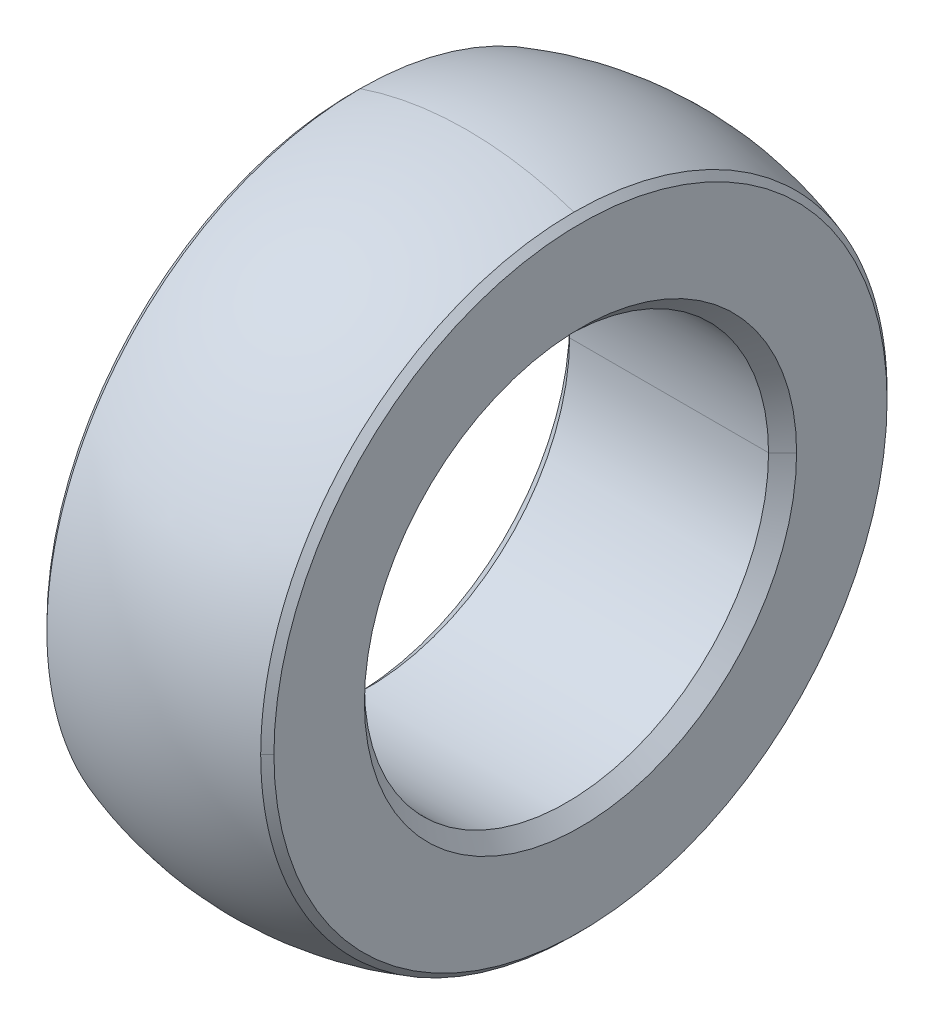
ISO-10303-21;
HEADER;
FILE_DESCRIPTION(('STEP AP214'),'2;1');
FILE_NAME('part.step','',(''),(''),'','','');
FILE_SCHEMA(('AUTOMOTIVE_DESIGN { 1 0 10303 214 1 1 1 1 }'));
ENDSEC;
DATA;
#1=APPLICATION_CONTEXT('core data for automotive mechanical design processes');
#2=APPLICATION_PROTOCOL_DEFINITION('international standard','automotive_design',2000,#1);
#3=PRODUCT_CONTEXT('',#1,'mechanical');
#4=PRODUCT('Part','Part','',(#3));
#5=PRODUCT_RELATED_PRODUCT_CATEGORY('part','',(#4));
#6=PRODUCT_DEFINITION_FORMATION('','',#4);
#7=PRODUCT_DEFINITION_CONTEXT('part definition',#1,'design');
#8=PRODUCT_DEFINITION('design','',#6,#7);
#9=PRODUCT_DEFINITION_SHAPE('','',#8);
#10=(LENGTH_UNIT() NAMED_UNIT(*) SI_UNIT(.MILLI.,.METRE.));
#11=(NAMED_UNIT(*) PLANE_ANGLE_UNIT() SI_UNIT($,.RADIAN.));
#12=(NAMED_UNIT(*) SI_UNIT($,.STERADIAN.) SOLID_ANGLE_UNIT());
#13=UNCERTAINTY_MEASURE_WITH_UNIT(LENGTH_MEASURE(1.E-05),#10,'distance_accuracy_value','');
#14=(GEOMETRIC_REPRESENTATION_CONTEXT(3) GLOBAL_UNCERTAINTY_ASSIGNED_CONTEXT((#13)) GLOBAL_UNIT_ASSIGNED_CONTEXT((#10,
#11,#12)) REPRESENTATION_CONTEXT('',''));
#15=CARTESIAN_POINT('',(0.,0.,0.));
#16=DIRECTION('',(0.,0.,1.));
#17=DIRECTION('',(1.,0.,0.));
#18=AXIS2_PLACEMENT_3D('',#15,#16,#17);
#19=CARTESIAN_POINT('',(0.,0.,0.));
#20=DIRECTION('',(-1.,0.,0.));
#21=DIRECTION('',(0.,0.,1.));
#22=AXIS2_PLACEMENT_3D('',#19,#20,#21);
#23=CONICAL_SURFACE('',#22,8.3185,0.78539816339745);
#24=DIRECTION('',(-0.707106781186546,0.,-0.707106781186549));
#25=VECTOR('',#24,1.);
#26=CARTESIAN_POINT('',(0.,0.,-8.3185));
#27=LINE('',#26,#25);
#28=CARTESIAN_POINT('',(0.53975,0.,-7.77875));
#29=VERTEX_POINT('',#28);
#30=CARTESIAN_POINT('',(0.,0.,-8.3185));
#31=VERTEX_POINT('',#30);
#32=EDGE_CURVE('E129',#29,#31,#27,.T.);
#33=ORIENTED_EDGE('',*,*,#32,.F.);
#34=CARTESIAN_POINT('',(0.53975,0.,0.));
#35=DIRECTION('',(-1.,0.,0.));
#36=DIRECTION('',(0.,0.,1.));
#37=AXIS2_PLACEMENT_3D('',#34,#35,#36);
#38=CIRCLE('',#37,7.77875);
#39=CARTESIAN_POINT('',(0.53975,0.,7.77875));
#40=VERTEX_POINT('',#39);
#41=EDGE_CURVE('E11',#40,#29,#38,.T.);
#42=ORIENTED_EDGE('',*,*,#41,.F.);
#43=DIRECTION('',(-0.707106781186546,0.,0.707106781186549));
#44=VECTOR('',#43,1.);
#45=CARTESIAN_POINT('',(0.,0.,8.3185));
#46=LINE('',#45,#44);
#47=CARTESIAN_POINT('',(0.,0.,8.3185));
#48=VERTEX_POINT('',#47);
#49=EDGE_CURVE('E139',#40,#48,#46,.T.);
#50=ORIENTED_EDGE('',*,*,#49,.T.);
#51=CARTESIAN_POINT('',(0.,0.,0.));
#52=DIRECTION('',(-1.,0.,0.));
#53=DIRECTION('',(0.,0.,1.));
#54=AXIS2_PLACEMENT_3D('',#51,#52,#53);
#55=CIRCLE('',#54,8.3185);
#56=EDGE_CURVE('E131',#48,#31,#55,.T.);
#57=ORIENTED_EDGE('',*,*,#56,.T.);
#58=EDGE_LOOP('',(#33,#42,#50,#57));
#59=FACE_BOUND('',#58,.T.);
#60=ADVANCED_FACE('F17',(#59),#23,.F.);
#61=CARTESIAN_POINT('',(0.,0.,0.));
#62=DIRECTION('',(-1.,0.,0.));
#63=DIRECTION('',(0.,0.,1.));
#64=AXIS2_PLACEMENT_3D('',#61,#62,#63);
#65=CYLINDRICAL_SURFACE('',#64,7.77875);
#66=DIRECTION('',(-1.,0.,0.));
#67=VECTOR('',#66,1.);
#68=CARTESIAN_POINT('',(0.,0.,-7.77875));
#69=LINE('',#68,#67);
#70=CARTESIAN_POINT('',(8.19785,0.,-7.77875));
#71=VERTEX_POINT('',#70);
#72=EDGE_CURVE('E114',#71,#29,#69,.T.);
#73=ORIENTED_EDGE('',*,*,#72,.F.);
#74=CARTESIAN_POINT('',(8.19785,0.,0.));
#75=DIRECTION('',(-1.,0.,0.));
#76=DIRECTION('',(0.,0.,1.));
#77=AXIS2_PLACEMENT_3D('',#74,#75,#76);
#78=CIRCLE('',#77,7.77875);
#79=CARTESIAN_POINT('',(8.19785,0.,7.77875));
#80=VERTEX_POINT('',#79);
#81=EDGE_CURVE('E28',#80,#71,#78,.T.);
#82=ORIENTED_EDGE('',*,*,#81,.F.);
#83=DIRECTION('',(-1.,0.,0.));
#84=VECTOR('',#83,1.);
#85=CARTESIAN_POINT('',(0.,0.,7.77875));
#86=LINE('',#85,#84);
#87=EDGE_CURVE('E117',#80,#40,#86,.T.);
#88=ORIENTED_EDGE('',*,*,#87,.T.);
#89=ORIENTED_EDGE('',*,*,#41,.T.);
#90=EDGE_LOOP('',(#73,#82,#88,#89));
#91=FACE_BOUND('',#90,.T.);
#92=ADVANCED_FACE('F113',(#91),#65,.F.);
#93=CARTESIAN_POINT('',(8.19785,0.,0.));
#94=DIRECTION('',(1.,0.,0.));
#95=DIRECTION('',(0.,0.,-1.));
#96=AXIS2_PLACEMENT_3D('',#93,#94,#95);
#97=CONICAL_SURFACE('',#96,7.77875,0.785398163397448);
#98=DIRECTION('',(0.707106781186548,0.,0.707106781186547));
#99=VECTOR('',#98,1.);
#100=CARTESIAN_POINT('',(8.19785,0.,7.77875));
#101=LINE('',#100,#99);
#102=CARTESIAN_POINT('',(8.7376,0.,8.3185));
#103=VERTEX_POINT('',#102);
#104=EDGE_CURVE('E21',#80,#103,#101,.T.);
#105=ORIENTED_EDGE('',*,*,#104,.F.);
#106=ORIENTED_EDGE('',*,*,#81,.T.);
#107=DIRECTION('',(0.707106781186548,0.,-0.707106781186547));
#108=VECTOR('',#107,1.);
#109=CARTESIAN_POINT('',(8.19785,0.,-7.77875));
#110=LINE('',#109,#108);
#111=CARTESIAN_POINT('',(8.7376,0.,-8.3185));
#112=VERTEX_POINT('',#111);
#113=EDGE_CURVE('E233',#71,#112,#110,.T.);
#114=ORIENTED_EDGE('',*,*,#113,.T.);
#115=CARTESIAN_POINT('',(8.7376,0.,0.));
#116=DIRECTION('',(-1.,0.,0.));
#117=DIRECTION('',(0.,0.,1.));
#118=AXIS2_PLACEMENT_3D('',#115,#116,#117);
#119=CIRCLE('',#118,8.3185);
#120=EDGE_CURVE('E180',#103,#112,#119,.T.);
#121=ORIENTED_EDGE('',*,*,#120,.F.);
#122=EDGE_LOOP('',(#105,#106,#114,#121));
#123=FACE_BOUND('',#122,.T.);
#124=ADVANCED_FACE('F249',(#123),#97,.F.);
#125=CARTESIAN_POINT('',(8.7376,8.3185,0.));
#126=DIRECTION('',(-1.,0.,0.));
#127=DIRECTION('',(0.,0.,1.));
#128=AXIS2_PLACEMENT_3D('',#125,#126,#127);
#129=PLANE('',#128);
#130=CARTESIAN_POINT('',(8.7376,0.,0.));
#131=DIRECTION('',(-1.,0.,0.));
#132=DIRECTION('',(0.,0.,1.));
#133=AXIS2_PLACEMENT_3D('',#130,#131,#132);
#134=CIRCLE('',#133,8.3185);
#135=EDGE_CURVE('E230',#112,#103,#134,.T.);
#136=ORIENTED_EDGE('',*,*,#135,.T.);
#137=ORIENTED_EDGE('',*,*,#120,.T.);
#138=EDGE_LOOP('',(#136,#137));
#139=FACE_BOUND('',#138,.T.);
#140=CARTESIAN_POINT('',(8.7376,0.,0.));
#141=DIRECTION('',(-1.,0.,0.));
#142=DIRECTION('',(0.,0.,1.));
#143=AXIS2_PLACEMENT_3D('',#140,#141,#142);
#144=CIRCLE('',#143,11.801190275147);
#145=CARTESIAN_POINT('',(8.7376,0.,11.801190275147));
#146=VERTEX_POINT('',#145);
#147=CARTESIAN_POINT('',(8.7376,0.,-11.801190275147));
#148=VERTEX_POINT('',#147);
#149=EDGE_CURVE('E164',#146,#148,#144,.T.);
#150=ORIENTED_EDGE('',*,*,#149,.F.);
#151=CARTESIAN_POINT('',(8.7376,0.,0.));
#152=DIRECTION('',(-1.,0.,0.));
#153=DIRECTION('',(0.,0.,1.));
#154=AXIS2_PLACEMENT_3D('',#151,#152,#153);
#155=CIRCLE('',#154,11.801190275147);
#156=EDGE_CURVE('E158',#148,#146,#155,.T.);
#157=ORIENTED_EDGE('',*,*,#156,.F.);
#158=EDGE_LOOP('',(#150,#157));
#159=FACE_BOUND('',#158,.T.);
#160=ADVANCED_FACE('F19',(#139,#159),#129,.F.);
#161=CARTESIAN_POINT('',(8.7376,0.,0.));
#162=DIRECTION('',(-1.,0.,0.));
#163=DIRECTION('',(0.,0.,1.));
#164=AXIS2_PLACEMENT_3D('',#161,#162,#163);
#165=CONICAL_SURFACE('',#164,11.801190275147,0.785398163397442);
#166=DIRECTION('',(-0.707106781186552,0.,-0.707106781186543));
#167=VECTOR('',#166,1.);
#168=CARTESIAN_POINT('',(8.7376,0.,-11.801190275147));
#169=LINE('',#168,#167);
#170=CARTESIAN_POINT('',(8.4836,0.,-12.055190275147));
#171=VERTEX_POINT('',#170);
#172=EDGE_CURVE('E159',#148,#171,#169,.T.);
#173=ORIENTED_EDGE('',*,*,#172,.F.);
#174=ORIENTED_EDGE('',*,*,#156,.T.);
#175=DIRECTION('',(-0.707106781186552,0.,0.707106781186543));
#176=VECTOR('',#175,1.);
#177=CARTESIAN_POINT('',(8.7376,0.,11.801190275147));
#178=LINE('',#177,#176);
#179=CARTESIAN_POINT('',(8.4836,0.,12.055190275147));
#180=VERTEX_POINT('',#179);
#181=EDGE_CURVE('E148',#146,#180,#178,.T.);
#182=ORIENTED_EDGE('',*,*,#181,.T.);
#183=CARTESIAN_POINT('',(8.4836,0.,0.));
#184=DIRECTION('',(-1.,0.,0.));
#185=DIRECTION('',(0.,0.,1.));
#186=AXIS2_PLACEMENT_3D('',#183,#184,#185);
#187=CIRCLE('',#186,12.055190275147);
#188=CARTESIAN_POINT('',(8.4836,-12.055190275147,0.));
#189=VERTEX_POINT('',#188);
#190=EDGE_CURVE('E155',#189,#180,#187,.T.);
#191=ORIENTED_EDGE('',*,*,#190,.F.);
#192=CARTESIAN_POINT('',(8.4836,0.,0.));
#193=DIRECTION('',(-1.,0.,0.));
#194=DIRECTION('',(0.,0.,1.));
#195=AXIS2_PLACEMENT_3D('',#192,#193,#194);
#196=CIRCLE('',#195,12.055190275147);
#197=EDGE_CURVE('E203',#171,#189,#196,.T.);
#198=ORIENTED_EDGE('',*,*,#197,.F.);
#199=EDGE_LOOP('',(#173,#174,#182,#191,#198));
#200=FACE_BOUND('',#199,.T.);
#201=ADVANCED_FACE('F287',(#200),#165,.T.);
#202=CARTESIAN_POINT('',(4.3688,0.,0.));
#203=DIRECTION('',(0.,0.,-1.));
#204=DIRECTION('',(0.,1.,0.));
#205=AXIS2_PLACEMENT_3D('',#202,#203,#204);
#206=SPHERICAL_SURFACE('',#205,12.7381);
#207=CARTESIAN_POINT('',(4.3688,0.,0.));
#208=DIRECTION('',(0.,0.,-1.));
#209=DIRECTION('',(0.,1.,0.));
#210=AXIS2_PLACEMENT_3D('',#207,#208,#209);
#211=CIRCLE('',#210,12.7381);
#212=CARTESIAN_POINT('',(0.254,-12.055190275147,0.));
#213=VERTEX_POINT('',#212);
#214=EDGE_CURVE('E178',#189,#213,#211,.T.);
#215=ORIENTED_EDGE('',*,*,#214,.F.);
#216=ORIENTED_EDGE('',*,*,#190,.T.);
#217=CARTESIAN_POINT('',(8.4836,0.,0.));
#218=DIRECTION('',(-1.,0.,0.));
#219=DIRECTION('',(0.,0.,1.));
#220=AXIS2_PLACEMENT_3D('',#217,#218,#219);
#221=CIRCLE('',#220,12.055190275147);
#222=CARTESIAN_POINT('',(8.4836,12.055190275147,0.));
#223=VERTEX_POINT('',#222);
#224=EDGE_CURVE('E215',#180,#223,#221,.T.);
#225=ORIENTED_EDGE('',*,*,#224,.T.);
#226=CARTESIAN_POINT('',(4.3688,0.,0.));
#227=DIRECTION('',(0.,0.,1.));
#228=DIRECTION('',(1.,0.,0.));
#229=AXIS2_PLACEMENT_3D('',#226,#227,#228);
#230=CIRCLE('',#229,12.7381);
#231=CARTESIAN_POINT('',(0.254,12.055190275147,0.));
#232=VERTEX_POINT('',#231);
#233=EDGE_CURVE('E170',#223,#232,#230,.T.);
#234=ORIENTED_EDGE('',*,*,#233,.T.);
#235=CARTESIAN_POINT('',(0.254,0.,0.));
#236=DIRECTION('',(-1.,0.,0.));
#237=DIRECTION('',(0.,0.,1.));
#238=AXIS2_PLACEMENT_3D('',#235,#236,#237);
#239=CIRCLE('',#238,12.055190275147);
#240=CARTESIAN_POINT('',(0.254,0.,12.055190275147));
#241=VERTEX_POINT('',#240);
#242=EDGE_CURVE('E150',#241,#232,#239,.T.);
#243=ORIENTED_EDGE('',*,*,#242,.F.);
#244=CARTESIAN_POINT('',(0.254,0.,0.));
#245=DIRECTION('',(-1.,0.,0.));
#246=DIRECTION('',(0.,0.,1.));
#247=AXIS2_PLACEMENT_3D('',#244,#245,#246);
#248=CIRCLE('',#247,12.055190275147);
#249=EDGE_CURVE('E43',#213,#241,#248,.T.);
#250=ORIENTED_EDGE('',*,*,#249,.F.);
#251=EDGE_LOOP('',(#215,#216,#225,#234,#243,#250));
#252=FACE_BOUND('',#251,.T.);
#253=ADVANCED_FACE('F281',(#252),#206,.T.);
#254=CARTESIAN_POINT('',(0.254,0.,0.));
#255=DIRECTION('',(1.,0.,0.));
#256=DIRECTION('',(0.,0.,-1.));
#257=AXIS2_PLACEMENT_3D('',#254,#255,#256);
#258=CONICAL_SURFACE('',#257,12.055190275147,0.785398163397446);
#259=DIRECTION('',(0.707106781186549,0.,0.707106781186546));
#260=VECTOR('',#259,1.);
#261=CARTESIAN_POINT('',(0.254,0.,12.055190275147));
#262=LINE('',#261,#260);
#263=CARTESIAN_POINT('',(0.,0.,11.801190275147));
#264=VERTEX_POINT('',#263);
#265=EDGE_CURVE('E154',#264,#241,#262,.T.);
#266=ORIENTED_EDGE('',*,*,#265,.F.);
#267=CARTESIAN_POINT('',(0.,0.,0.));
#268=DIRECTION('',(-1.,0.,0.));
#269=DIRECTION('',(0.,0.,1.));
#270=AXIS2_PLACEMENT_3D('',#267,#268,#269);
#271=CIRCLE('',#270,11.801190275147);
#272=CARTESIAN_POINT('',(0.,0.,-11.801190275147));
#273=VERTEX_POINT('',#272);
#274=EDGE_CURVE('E211',#273,#264,#271,.T.);
#275=ORIENTED_EDGE('',*,*,#274,.F.);
#276=DIRECTION('',(0.707106781186549,0.,-0.707106781186546));
#277=VECTOR('',#276,1.);
#278=CARTESIAN_POINT('',(0.254,0.,-12.055190275147));
#279=LINE('',#278,#277);
#280=CARTESIAN_POINT('',(0.254,0.,-12.055190275147));
#281=VERTEX_POINT('',#280);
#282=EDGE_CURVE('E153',#273,#281,#279,.T.);
#283=ORIENTED_EDGE('',*,*,#282,.T.);
#284=CARTESIAN_POINT('',(0.254,0.,0.));
#285=DIRECTION('',(-1.,0.,0.));
#286=DIRECTION('',(0.,0.,1.));
#287=AXIS2_PLACEMENT_3D('',#284,#285,#286);
#288=CIRCLE('',#287,12.055190275147);
#289=EDGE_CURVE('E174',#281,#213,#288,.T.);
#290=ORIENTED_EDGE('',*,*,#289,.T.);
#291=ORIENTED_EDGE('',*,*,#249,.T.);
#292=EDGE_LOOP('',(#266,#275,#283,#290,#291));
#293=FACE_BOUND('',#292,.T.);
#294=ADVANCED_FACE('F270',(#293),#258,.T.);
#295=CARTESIAN_POINT('',(0.,11.801190275147,0.));
#296=DIRECTION('',(1.,0.,0.));
#297=DIRECTION('',(0.,1.,0.));
#298=AXIS2_PLACEMENT_3D('',#295,#296,#297);
#299=PLANE('',#298);
#300=ORIENTED_EDGE('',*,*,#56,.F.);
#301=CARTESIAN_POINT('',(0.,0.,0.));
#302=DIRECTION('',(-1.,0.,0.));
#303=DIRECTION('',(0.,0.,1.));
#304=AXIS2_PLACEMENT_3D('',#301,#302,#303);
#305=CIRCLE('',#304,8.3185);
#306=EDGE_CURVE('E136',#31,#48,#305,.T.);
#307=ORIENTED_EDGE('',*,*,#306,.F.);
#308=EDGE_LOOP('',(#300,#307));
#309=FACE_BOUND('',#308,.T.);
#310=ORIENTED_EDGE('',*,*,#274,.T.);
#311=CARTESIAN_POINT('',(0.,0.,0.));
#312=DIRECTION('',(-1.,0.,0.));
#313=DIRECTION('',(0.,0.,1.));
#314=AXIS2_PLACEMENT_3D('',#311,#312,#313);
#315=CIRCLE('',#314,11.801190275147);
#316=EDGE_CURVE('E167',#264,#273,#315,.T.);
#317=ORIENTED_EDGE('',*,*,#316,.T.);
#318=EDGE_LOOP('',(#310,#317));
#319=FACE_BOUND('',#318,.T.);
#320=ADVANCED_FACE('F266',(#309,#319),#299,.F.);
#321=CARTESIAN_POINT('',(0.254,0.,0.));
#322=DIRECTION('',(1.,0.,0.));
#323=DIRECTION('',(0.,0.,-1.));
#324=AXIS2_PLACEMENT_3D('',#321,#322,#323);
#325=CONICAL_SURFACE('',#324,12.055190275147,0.785398163397446);
#326=ORIENTED_EDGE('',*,*,#316,.F.);
#327=ORIENTED_EDGE('',*,*,#265,.T.);
#328=ORIENTED_EDGE('',*,*,#242,.T.);
#329=CARTESIAN_POINT('',(0.254,0.,0.));
#330=DIRECTION('',(-1.,0.,0.));
#331=DIRECTION('',(0.,0.,1.));
#332=AXIS2_PLACEMENT_3D('',#329,#330,#331);
#333=CIRCLE('',#332,12.055190275147);
#334=EDGE_CURVE('E177',#232,#281,#333,.T.);
#335=ORIENTED_EDGE('',*,*,#334,.T.);
#336=ORIENTED_EDGE('',*,*,#282,.F.);
#337=EDGE_LOOP('',(#326,#327,#328,#335,#336));
#338=FACE_BOUND('',#337,.T.);
#339=ADVANCED_FACE('F269',(#338),#325,.T.);
#340=CARTESIAN_POINT('',(4.3688,0.,0.));
#341=DIRECTION('',(0.,0.,-1.));
#342=DIRECTION('',(0.,1.,0.));
#343=AXIS2_PLACEMENT_3D('',#340,#341,#342);
#344=SPHERICAL_SURFACE('',#343,12.7381);
#345=CARTESIAN_POINT('',(8.4836,0.,0.));
#346=DIRECTION('',(-1.,0.,0.));
#347=DIRECTION('',(0.,0.,1.));
#348=AXIS2_PLACEMENT_3D('',#345,#346,#347);
#349=CIRCLE('',#348,12.055190275147);
#350=EDGE_CURVE('E163',#223,#171,#349,.T.);
#351=ORIENTED_EDGE('',*,*,#350,.T.);
#352=ORIENTED_EDGE('',*,*,#197,.T.);
#353=ORIENTED_EDGE('',*,*,#214,.T.);
#354=ORIENTED_EDGE('',*,*,#289,.F.);
#355=ORIENTED_EDGE('',*,*,#334,.F.);
#356=ORIENTED_EDGE('',*,*,#233,.F.);
#357=EDGE_LOOP('',(#351,#352,#353,#354,#355,#356));
#358=FACE_BOUND('',#357,.T.);
#359=ADVANCED_FACE('F279',(#358),#344,.T.);
#360=CARTESIAN_POINT('',(8.7376,0.,0.));
#361=DIRECTION('',(-1.,0.,0.));
#362=DIRECTION('',(0.,0.,1.));
#363=AXIS2_PLACEMENT_3D('',#360,#361,#362);
#364=CONICAL_SURFACE('',#363,11.801190275147,0.785398163397442);
#365=ORIENTED_EDGE('',*,*,#149,.T.);
#366=ORIENTED_EDGE('',*,*,#172,.T.);
#367=ORIENTED_EDGE('',*,*,#350,.F.);
#368=ORIENTED_EDGE('',*,*,#224,.F.);
#369=ORIENTED_EDGE('',*,*,#181,.F.);
#370=EDGE_LOOP('',(#365,#366,#367,#368,#369));
#371=FACE_BOUND('',#370,.T.);
#372=ADVANCED_FACE('F285',(#371),#364,.T.);
#373=CARTESIAN_POINT('',(8.19785,0.,0.));
#374=DIRECTION('',(1.,0.,0.));
#375=DIRECTION('',(0.,0.,-1.));
#376=AXIS2_PLACEMENT_3D('',#373,#374,#375);
#377=CONICAL_SURFACE('',#376,7.77875,0.785398163397448);
#378=CARTESIAN_POINT('',(8.19785,0.,0.));
#379=DIRECTION('',(-1.,0.,0.));
#380=DIRECTION('',(0.,0.,1.));
#381=AXIS2_PLACEMENT_3D('',#378,#379,#380);
#382=CIRCLE('',#381,7.77875);
#383=EDGE_CURVE('E125',#71,#80,#382,.T.);
#384=ORIENTED_EDGE('',*,*,#383,.T.);
#385=ORIENTED_EDGE('',*,*,#104,.T.);
#386=ORIENTED_EDGE('',*,*,#135,.F.);
#387=ORIENTED_EDGE('',*,*,#113,.F.);
#388=EDGE_LOOP('',(#384,#385,#386,#387));
#389=FACE_BOUND('',#388,.T.);
#390=ADVANCED_FACE('F252',(#389),#377,.F.);
#391=CARTESIAN_POINT('',(0.,0.,0.));
#392=DIRECTION('',(-1.,0.,0.));
#393=DIRECTION('',(0.,0.,1.));
#394=AXIS2_PLACEMENT_3D('',#391,#392,#393);
#395=CYLINDRICAL_SURFACE('',#394,7.77875);
#396=ORIENTED_EDGE('',*,*,#383,.F.);
#397=ORIENTED_EDGE('',*,*,#72,.T.);
#398=CARTESIAN_POINT('',(0.53975,0.,0.));
#399=DIRECTION('',(-1.,0.,0.));
#400=DIRECTION('',(0.,0.,1.));
#401=AXIS2_PLACEMENT_3D('',#398,#399,#400);
#402=CIRCLE('',#401,7.77875);
#403=EDGE_CURVE('E123',#29,#40,#402,.T.);
#404=ORIENTED_EDGE('',*,*,#403,.T.);
#405=ORIENTED_EDGE('',*,*,#87,.F.);
#406=EDGE_LOOP('',(#396,#397,#404,#405));
#407=FACE_BOUND('',#406,.T.);
#408=ADVANCED_FACE('F121',(#407),#395,.F.);
#409=CARTESIAN_POINT('',(0.,0.,0.));
#410=DIRECTION('',(-1.,0.,0.));
#411=DIRECTION('',(0.,0.,1.));
#412=AXIS2_PLACEMENT_3D('',#409,#410,#411);
#413=CONICAL_SURFACE('',#412,8.3185,0.78539816339745);
#414=ORIENTED_EDGE('',*,*,#403,.F.);
#415=ORIENTED_EDGE('',*,*,#32,.T.);
#416=ORIENTED_EDGE('',*,*,#306,.T.);
#417=ORIENTED_EDGE('',*,*,#49,.F.);
#418=EDGE_LOOP('',(#414,#415,#416,#417));
#419=FACE_BOUND('',#418,.T.);
#420=ADVANCED_FACE('F138',(#419),#413,.F.);
#421=CLOSED_SHELL('',(#60,#92,#124,#160,#201,#253,#294,#320,#339,#359,#372,#390,#408,#420));
#422=MANIFOLD_SOLID_BREP('B1',#421);
#423=ADVANCED_BREP_SHAPE_REPRESENTATION('',(#18,#422),#14);
#424=SHAPE_DEFINITION_REPRESENTATION(#9,#423);
ENDSEC;
END-ISO-10303-21;
